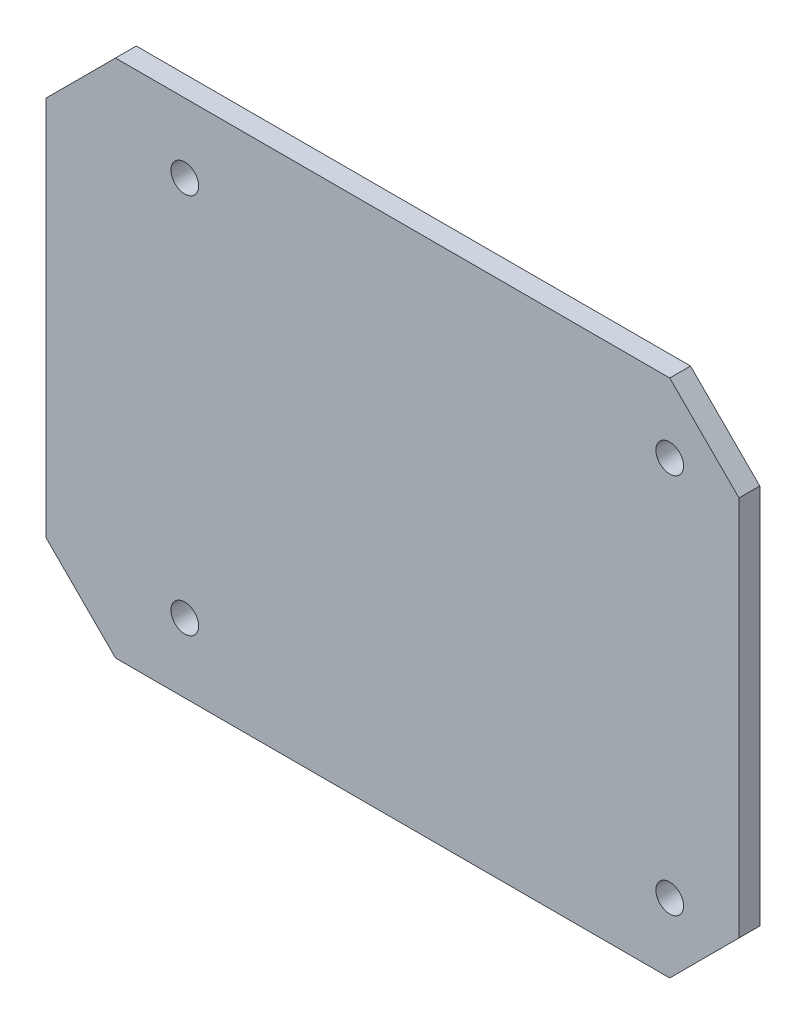
ISO-10303-21;
HEADER;
FILE_DESCRIPTION(('STEP AP214'),'2;1');
FILE_NAME('part.step','',(''),(''),'','','');
FILE_SCHEMA(('AUTOMOTIVE_DESIGN { 1 0 10303 214 1 1 1 1 }'));
ENDSEC;
DATA;
#1=APPLICATION_CONTEXT('core data for automotive mechanical design processes');
#2=APPLICATION_PROTOCOL_DEFINITION('international standard','automotive_design',2000,#1);
#3=PRODUCT_CONTEXT('',#1,'mechanical');
#4=PRODUCT('Part','Part','',(#3));
#5=PRODUCT_RELATED_PRODUCT_CATEGORY('part','',(#4));
#6=PRODUCT_DEFINITION_FORMATION('','',#4);
#7=PRODUCT_DEFINITION_CONTEXT('part definition',#1,'design');
#8=PRODUCT_DEFINITION('design','',#6,#7);
#9=PRODUCT_DEFINITION_SHAPE('','',#8);
#10=(LENGTH_UNIT() NAMED_UNIT(*) SI_UNIT(.MILLI.,.METRE.));
#11=(NAMED_UNIT(*) PLANE_ANGLE_UNIT() SI_UNIT($,.RADIAN.));
#12=(NAMED_UNIT(*) SI_UNIT($,.STERADIAN.) SOLID_ANGLE_UNIT());
#13=UNCERTAINTY_MEASURE_WITH_UNIT(LENGTH_MEASURE(1.E-05),#10,'distance_accuracy_value','');
#14=(GEOMETRIC_REPRESENTATION_CONTEXT(3) GLOBAL_UNCERTAINTY_ASSIGNED_CONTEXT((#13)) GLOBAL_UNIT_ASSIGNED_CONTEXT((#10,
#11,#12)) REPRESENTATION_CONTEXT('',''));
#15=CARTESIAN_POINT('',(0.,0.,0.));
#16=DIRECTION('',(0.,0.,1.));
#17=DIRECTION('',(1.,0.,0.));
#18=AXIS2_PLACEMENT_3D('',#15,#16,#17);
#19=CARTESIAN_POINT('',(-99.9999999999999,-541.588058284611,-6.));
#20=DIRECTION('',(-1.,0.,0.));
#21=DIRECTION('',(0.,-1.,0.));
#22=AXIS2_PLACEMENT_3D('',#19,#20,#21);
#23=PLANE('',#22);
#24=DIRECTION('',(0.,-1.,0.));
#25=VECTOR('',#24,1.);
#26=CARTESIAN_POINT('',(-99.9999999999999,-541.588058284611,-6.));
#27=LINE('',#26,#25);
#28=CARTESIAN_POINT('',(-100.,-561.588058284611,-6.));
#29=VERTEX_POINT('',#28);
#30=CARTESIAN_POINT('',(-99.9999999999999,-671.588058284611,-6.));
#31=VERTEX_POINT('',#30);
#32=EDGE_CURVE('E138',#29,#31,#27,.T.);
#33=ORIENTED_EDGE('',*,*,#32,.T.);
#34=DIRECTION('',(0.,0.,1.));
#35=VECTOR('',#34,1.);
#36=CARTESIAN_POINT('',(-99.9999999999999,-671.588058284611,-6.));
#37=LINE('',#36,#35);
#38=CARTESIAN_POINT('',(-99.9999999999999,-671.588058284611,0.));
#39=VERTEX_POINT('',#38);
#40=EDGE_CURVE('E180',#31,#39,#37,.T.);
#41=ORIENTED_EDGE('',*,*,#40,.T.);
#42=DIRECTION('',(0.,-1.,0.));
#43=VECTOR('',#42,1.);
#44=CARTESIAN_POINT('',(-99.9999999999999,-541.588058284611,0.));
#45=LINE('',#44,#43);
#46=CARTESIAN_POINT('',(-99.9999999999999,-561.588058284611,0.));
#47=VERTEX_POINT('',#46);
#48=EDGE_CURVE('E186',#47,#39,#45,.T.);
#49=ORIENTED_EDGE('',*,*,#48,.F.);
#50=DIRECTION('',(0.,0.,-1.));
#51=VECTOR('',#50,1.);
#52=CARTESIAN_POINT('',(-99.9999999999999,-561.588058284611,-6.));
#53=LINE('',#52,#51);
#54=EDGE_CURVE('E147',#47,#29,#53,.T.);
#55=ORIENTED_EDGE('',*,*,#54,.T.);
#56=EDGE_LOOP('',(#33,#41,#49,#55));
#57=FACE_BOUND('',#56,.T.);
#58=ADVANCED_FACE('F67',(#57),#23,.T.);
#59=CARTESIAN_POINT('',(100.,-541.588058284611,-6.));
#60=DIRECTION('',(0.,1.,0.));
#61=DIRECTION('',(0.,0.,1.));
#62=AXIS2_PLACEMENT_3D('',#59,#60,#61);
#63=PLANE('',#62);
#64=DIRECTION('',(-1.,0.,0.));
#65=VECTOR('',#64,1.);
#66=CARTESIAN_POINT('',(100.,-541.588058284611,0.));
#67=LINE('',#66,#65);
#68=CARTESIAN_POINT('',(80.0000000000001,-541.588058284611,0.));
#69=VERTEX_POINT('',#68);
#70=CARTESIAN_POINT('',(-79.9999999999999,-541.588058284611,0.));
#71=VERTEX_POINT('',#70);
#72=EDGE_CURVE('E128',#69,#71,#67,.T.);
#73=ORIENTED_EDGE('',*,*,#72,.F.);
#74=DIRECTION('',(0.,0.,-1.));
#75=VECTOR('',#74,1.);
#76=CARTESIAN_POINT('',(80.0000000000001,-541.588058284611,-6.));
#77=LINE('',#76,#75);
#78=CARTESIAN_POINT('',(79.9999999999999,-541.588058284611,-6.));
#79=VERTEX_POINT('',#78);
#80=EDGE_CURVE('E165',#69,#79,#77,.T.);
#81=ORIENTED_EDGE('',*,*,#80,.T.);
#82=DIRECTION('',(-1.,0.,0.));
#83=VECTOR('',#82,1.);
#84=CARTESIAN_POINT('',(100.,-541.588058284611,-6.));
#85=LINE('',#84,#83);
#86=CARTESIAN_POINT('',(-80.,-541.588058284611,-6.));
#87=VERTEX_POINT('',#86);
#88=EDGE_CURVE('E151',#79,#87,#85,.T.);
#89=ORIENTED_EDGE('',*,*,#88,.T.);
#90=DIRECTION('',(0.,0.,1.));
#91=VECTOR('',#90,1.);
#92=CARTESIAN_POINT('',(-79.9999999999999,-541.588058284611,-6.));
#93=LINE('',#92,#91);
#94=EDGE_CURVE('E146',#87,#71,#93,.T.);
#95=ORIENTED_EDGE('',*,*,#94,.T.);
#96=EDGE_LOOP('',(#73,#81,#89,#95));
#97=FACE_BOUND('',#96,.T.);
#98=ADVANCED_FACE('F149',(#97),#63,.T.);
#99=CARTESIAN_POINT('',(100.,-541.588058284611,-6.));
#100=DIRECTION('',(1.,0.,0.));
#101=DIRECTION('',(0.,1.,0.));
#102=AXIS2_PLACEMENT_3D('',#99,#100,#101);
#103=PLANE('',#102);
#104=DIRECTION('',(0.,1.,0.));
#105=VECTOR('',#104,1.);
#106=CARTESIAN_POINT('',(100.,-541.588058284611,0.));
#107=LINE('',#106,#105);
#108=CARTESIAN_POINT('',(100.,-671.588058284611,0.));
#109=VERTEX_POINT('',#108);
#110=CARTESIAN_POINT('',(100.,-561.588058284611,0.));
#111=VERTEX_POINT('',#110);
#112=EDGE_CURVE('E139',#109,#111,#107,.T.);
#113=ORIENTED_EDGE('',*,*,#112,.F.);
#114=DIRECTION('',(0.,0.,-1.));
#115=VECTOR('',#114,1.);
#116=CARTESIAN_POINT('',(100.,-671.588058284611,-6.));
#117=LINE('',#116,#115);
#118=CARTESIAN_POINT('',(100.,-671.588058284611,-6.));
#119=VERTEX_POINT('',#118);
#120=EDGE_CURVE('E175',#109,#119,#117,.T.);
#121=ORIENTED_EDGE('',*,*,#120,.T.);
#122=DIRECTION('',(0.,1.,0.));
#123=VECTOR('',#122,1.);
#124=CARTESIAN_POINT('',(100.,-541.588058284611,-6.));
#125=LINE('',#124,#123);
#126=CARTESIAN_POINT('',(100.,-561.588058284611,-6.));
#127=VERTEX_POINT('',#126);
#128=EDGE_CURVE('E154',#119,#127,#125,.T.);
#129=ORIENTED_EDGE('',*,*,#128,.T.);
#130=DIRECTION('',(0.,0.,1.));
#131=VECTOR('',#130,1.);
#132=CARTESIAN_POINT('',(100.,-561.588058284611,-6.));
#133=LINE('',#132,#131);
#134=EDGE_CURVE('E161',#127,#111,#133,.T.);
#135=ORIENTED_EDGE('',*,*,#134,.T.);
#136=EDGE_LOOP('',(#113,#121,#129,#135));
#137=FACE_BOUND('',#136,.T.);
#138=ADVANCED_FACE('F206',(#137),#103,.T.);
#139=CARTESIAN_POINT('',(100.,-691.588058284611,-6.));
#140=DIRECTION('',(0.,-1.,0.));
#141=DIRECTION('',(0.,0.,-1.));
#142=AXIS2_PLACEMENT_3D('',#139,#140,#141);
#143=PLANE('',#142);
#144=DIRECTION('',(1.,0.,0.));
#145=VECTOR('',#144,1.);
#146=CARTESIAN_POINT('',(100.,-691.588058284611,0.));
#147=LINE('',#146,#145);
#148=CARTESIAN_POINT('',(-79.9999999999999,-691.588058284611,0.));
#149=VERTEX_POINT('',#148);
#150=CARTESIAN_POINT('',(80.0000000000001,-691.588058284611,0.));
#151=VERTEX_POINT('',#150);
#152=EDGE_CURVE('E190',#149,#151,#147,.T.);
#153=ORIENTED_EDGE('',*,*,#152,.F.);
#154=DIRECTION('',(0.,0.,-1.));
#155=VECTOR('',#154,1.);
#156=CARTESIAN_POINT('',(-79.9999999999999,-691.588058284611,-6.));
#157=LINE('',#156,#155);
#158=CARTESIAN_POINT('',(-80.,-691.588058284611,-6.));
#159=VERTEX_POINT('',#158);
#160=EDGE_CURVE('E75',#149,#159,#157,.T.);
#161=ORIENTED_EDGE('',*,*,#160,.T.);
#162=DIRECTION('',(1.,0.,0.));
#163=VECTOR('',#162,1.);
#164=CARTESIAN_POINT('',(100.,-691.588058284611,-6.));
#165=LINE('',#164,#163);
#166=CARTESIAN_POINT('',(80.0000000000001,-691.588058284611,-6.));
#167=VERTEX_POINT('',#166);
#168=EDGE_CURVE('E210',#159,#167,#165,.T.);
#169=ORIENTED_EDGE('',*,*,#168,.T.);
#170=DIRECTION('',(0.,0.,1.));
#171=VECTOR('',#170,1.);
#172=CARTESIAN_POINT('',(80.0000000000001,-691.588058284611,-6.));
#173=LINE('',#172,#171);
#174=EDGE_CURVE('E170',#167,#151,#173,.T.);
#175=ORIENTED_EDGE('',*,*,#174,.T.);
#176=EDGE_LOOP('',(#153,#161,#169,#175));
#177=FACE_BOUND('',#176,.T.);
#178=ADVANCED_FACE('F240',(#177),#143,.T.);
#179=CARTESIAN_POINT('',(0.,0.,-6.));
#180=DIRECTION('',(0.,0.,-1.));
#181=DIRECTION('',(-1.,0.,0.));
#182=AXIS2_PLACEMENT_3D('',#179,#180,#181);
#183=PLANE('',#182);
#184=CARTESIAN_POINT('',(80.0000000000001,-561.588058284611,-6.));
#185=DIRECTION('',(0.,0.,-1.));
#186=DIRECTION('',(-1.,0.,0.));
#187=AXIS2_PLACEMENT_3D('',#184,#185,#186);
#188=CIRCLE('',#187,4.);
#189=CARTESIAN_POINT('',(76.0000000000001,-561.588058284611,-6.));
#190=VERTEX_POINT('',#189);
#191=EDGE_CURVE('E232',#190,#190,#188,.T.);
#192=ORIENTED_EDGE('',*,*,#191,.F.);
#193=EDGE_LOOP('',(#192));
#194=FACE_BOUND('',#193,.T.);
#195=CARTESIAN_POINT('',(80.0000000000001,-671.588058284611,-6.));
#196=DIRECTION('',(0.,0.,-1.));
#197=DIRECTION('',(-1.,0.,0.));
#198=AXIS2_PLACEMENT_3D('',#195,#196,#197);
#199=CIRCLE('',#198,4.);
#200=CARTESIAN_POINT('',(76.0000000000001,-671.588058284611,-6.));
#201=VERTEX_POINT('',#200);
#202=EDGE_CURVE('E226',#201,#201,#199,.T.);
#203=ORIENTED_EDGE('',*,*,#202,.F.);
#204=EDGE_LOOP('',(#203));
#205=FACE_BOUND('',#204,.T.);
#206=CARTESIAN_POINT('',(-60.,-561.588058284611,-6.));
#207=DIRECTION('',(0.,0.,-1.));
#208=DIRECTION('',(-1.,0.,0.));
#209=AXIS2_PLACEMENT_3D('',#206,#207,#208);
#210=CIRCLE('',#209,4.);
#211=CARTESIAN_POINT('',(-64.,-561.588058284611,-6.));
#212=VERTEX_POINT('',#211);
#213=EDGE_CURVE('E220',#212,#212,#210,.T.);
#214=ORIENTED_EDGE('',*,*,#213,.F.);
#215=EDGE_LOOP('',(#214));
#216=FACE_BOUND('',#215,.T.);
#217=CARTESIAN_POINT('',(-60.,-671.588058284611,-6.));
#218=DIRECTION('',(0.,0.,-1.));
#219=DIRECTION('',(-1.,0.,0.));
#220=AXIS2_PLACEMENT_3D('',#217,#218,#219);
#221=CIRCLE('',#220,4.);
#222=CARTESIAN_POINT('',(-64.,-671.588058284611,-6.));
#223=VERTEX_POINT('',#222);
#224=EDGE_CURVE('E195',#223,#223,#221,.T.);
#225=ORIENTED_EDGE('',*,*,#224,.F.);
#226=EDGE_LOOP('',(#225));
#227=FACE_BOUND('',#226,.T.);
#228=ORIENTED_EDGE('',*,*,#168,.F.);
#229=DIRECTION('',(0.707106781186547,-0.707106781186548,0.));
#230=VECTOR('',#229,1.);
#231=CARTESIAN_POINT('',(-385.794029142306,-385.794029142305,-6.));
#232=LINE('',#231,#230);
#233=EDGE_CURVE('E13',#159,#31,#232,.F.);
#234=ORIENTED_EDGE('',*,*,#233,.T.);
#235=ORIENTED_EDGE('',*,*,#32,.F.);
#236=DIRECTION('',(-0.707106781186548,-0.707106781186548,0.));
#237=VECTOR('',#236,1.);
#238=CARTESIAN_POINT('',(230.794029142306,-230.794029142306,-6.));
#239=LINE('',#238,#237);
#240=EDGE_CURVE('E159',#29,#87,#239,.F.);
#241=ORIENTED_EDGE('',*,*,#240,.T.);
#242=ORIENTED_EDGE('',*,*,#88,.F.);
#243=DIRECTION('',(-0.707106781186547,0.707106781186548,0.));
#244=VECTOR('',#243,1.);
#245=CARTESIAN_POINT('',(-230.794029142305,-230.794029142305,-6.));
#246=LINE('',#245,#244);
#247=EDGE_CURVE('E167',#79,#127,#246,.F.);
#248=ORIENTED_EDGE('',*,*,#247,.T.);
#249=ORIENTED_EDGE('',*,*,#128,.F.);
#250=DIRECTION('',(0.707106781186547,0.707106781186548,0.));
#251=VECTOR('',#250,1.);
#252=CARTESIAN_POINT('',(385.794029142306,-385.794029142305,-6.));
#253=LINE('',#252,#251);
#254=EDGE_CURVE('E177',#119,#167,#253,.F.);
#255=ORIENTED_EDGE('',*,*,#254,.T.);
#256=EDGE_LOOP('',(#228,#234,#235,#241,#242,#248,#249,#255));
#257=FACE_BOUND('',#256,.T.);
#258=ADVANCED_FACE('F211',(#194,#205,#216,#227,#257),#183,.T.);
#259=CARTESIAN_POINT('',(0.,0.,0.));
#260=DIRECTION('',(0.,0.,-1.));
#261=DIRECTION('',(-1.,0.,0.));
#262=AXIS2_PLACEMENT_3D('',#259,#260,#261);
#263=PLANE('',#262);
#264=CARTESIAN_POINT('',(80.0000000000001,-561.588058284611,0.));
#265=DIRECTION('',(0.,0.,-1.));
#266=DIRECTION('',(-1.,0.,0.));
#267=AXIS2_PLACEMENT_3D('',#264,#265,#266);
#268=CIRCLE('',#267,4.);
#269=CARTESIAN_POINT('',(76.0000000000001,-561.588058284611,0.));
#270=VERTEX_POINT('',#269);
#271=EDGE_CURVE('E229',#270,#270,#268,.T.);
#272=ORIENTED_EDGE('',*,*,#271,.T.);
#273=EDGE_LOOP('',(#272));
#274=FACE_BOUND('',#273,.T.);
#275=CARTESIAN_POINT('',(80.0000000000001,-671.588058284611,0.));
#276=DIRECTION('',(0.,0.,-1.));
#277=DIRECTION('',(-1.,0.,0.));
#278=AXIS2_PLACEMENT_3D('',#275,#276,#277);
#279=CIRCLE('',#278,4.);
#280=CARTESIAN_POINT('',(76.0000000000001,-671.588058284611,0.));
#281=VERTEX_POINT('',#280);
#282=EDGE_CURVE('E223',#281,#281,#279,.T.);
#283=ORIENTED_EDGE('',*,*,#282,.T.);
#284=EDGE_LOOP('',(#283));
#285=FACE_BOUND('',#284,.T.);
#286=CARTESIAN_POINT('',(-60.,-561.588058284611,0.));
#287=DIRECTION('',(0.,0.,-1.));
#288=DIRECTION('',(-1.,0.,0.));
#289=AXIS2_PLACEMENT_3D('',#286,#287,#288);
#290=CIRCLE('',#289,4.);
#291=CARTESIAN_POINT('',(-64.,-561.588058284611,0.));
#292=VERTEX_POINT('',#291);
#293=EDGE_CURVE('E217',#292,#292,#290,.T.);
#294=ORIENTED_EDGE('',*,*,#293,.T.);
#295=EDGE_LOOP('',(#294));
#296=FACE_BOUND('',#295,.T.);
#297=CARTESIAN_POINT('',(-60.,-671.588058284611,0.));
#298=DIRECTION('',(0.,0.,-1.));
#299=DIRECTION('',(-1.,0.,0.));
#300=AXIS2_PLACEMENT_3D('',#297,#298,#299);
#301=CIRCLE('',#300,4.);
#302=CARTESIAN_POINT('',(-64.,-671.588058284611,0.));
#303=VERTEX_POINT('',#302);
#304=EDGE_CURVE('E191',#303,#303,#301,.T.);
#305=ORIENTED_EDGE('',*,*,#304,.T.);
#306=EDGE_LOOP('',(#305));
#307=FACE_BOUND('',#306,.T.);
#308=ORIENTED_EDGE('',*,*,#48,.T.);
#309=DIRECTION('',(-0.707106781186547,0.707106781186548,0.));
#310=VECTOR('',#309,1.);
#311=CARTESIAN_POINT('',(-99.9999999999999,-671.588058284611,0.));
#312=LINE('',#311,#310);
#313=EDGE_CURVE('E89',#39,#149,#312,.F.);
#314=ORIENTED_EDGE('',*,*,#313,.T.);
#315=ORIENTED_EDGE('',*,*,#152,.T.);
#316=DIRECTION('',(-0.707106781186547,-0.707106781186548,0.));
#317=VECTOR('',#316,1.);
#318=CARTESIAN_POINT('',(80.0000000000001,-691.588058284611,0.));
#319=LINE('',#318,#317);
#320=EDGE_CURVE('E173',#151,#109,#319,.F.);
#321=ORIENTED_EDGE('',*,*,#320,.T.);
#322=ORIENTED_EDGE('',*,*,#112,.T.);
#323=DIRECTION('',(0.707106781186547,-0.707106781186548,0.));
#324=VECTOR('',#323,1.);
#325=CARTESIAN_POINT('',(100.,-561.588058284611,0.));
#326=LINE('',#325,#324);
#327=EDGE_CURVE('E134',#111,#69,#326,.F.);
#328=ORIENTED_EDGE('',*,*,#327,.T.);
#329=ORIENTED_EDGE('',*,*,#72,.T.);
#330=DIRECTION('',(0.707106781186548,0.707106781186548,0.));
#331=VECTOR('',#330,1.);
#332=CARTESIAN_POINT('',(-79.9999999999999,-541.588058284611,0.));
#333=LINE('',#332,#331);
#334=EDGE_CURVE('E131',#71,#47,#333,.F.);
#335=ORIENTED_EDGE('',*,*,#334,.T.);
#336=EDGE_LOOP('',(#308,#314,#315,#321,#322,#328,#329,#335));
#337=FACE_BOUND('',#336,.T.);
#338=ADVANCED_FACE('F130',(#274,#285,#296,#307,#337),#263,.F.);
#339=CARTESIAN_POINT('',(-79.9999999999999,-541.588058284611,-6.));
#340=DIRECTION('',(0.707106781186547,-0.707106781186547,0.));
#341=DIRECTION('',(0.,0.,1.));
#342=AXIS2_PLACEMENT_3D('',#339,#340,#341);
#343=PLANE('',#342);
#344=ORIENTED_EDGE('',*,*,#240,.F.);
#345=ORIENTED_EDGE('',*,*,#54,.F.);
#346=ORIENTED_EDGE('',*,*,#334,.F.);
#347=ORIENTED_EDGE('',*,*,#94,.F.);
#348=EDGE_LOOP('',(#344,#345,#346,#347));
#349=FACE_BOUND('',#348,.T.);
#350=ADVANCED_FACE('F145',(#349),#343,.F.);
#351=CARTESIAN_POINT('',(100.,-561.588058284611,-6.));
#352=DIRECTION('',(-0.707106781186548,-0.707106781186547,0.));
#353=DIRECTION('',(0.,0.,1.));
#354=AXIS2_PLACEMENT_3D('',#351,#352,#353);
#355=PLANE('',#354);
#356=ORIENTED_EDGE('',*,*,#247,.F.);
#357=ORIENTED_EDGE('',*,*,#80,.F.);
#358=ORIENTED_EDGE('',*,*,#327,.F.);
#359=ORIENTED_EDGE('',*,*,#134,.F.);
#360=EDGE_LOOP('',(#356,#357,#358,#359));
#361=FACE_BOUND('',#360,.T.);
#362=ADVANCED_FACE('F205',(#361),#355,.F.);
#363=CARTESIAN_POINT('',(80.0000000000001,-691.588058284611,-6.));
#364=DIRECTION('',(-0.707106781186548,0.707106781186547,0.));
#365=DIRECTION('',(0.,0.,1.));
#366=AXIS2_PLACEMENT_3D('',#363,#364,#365);
#367=PLANE('',#366);
#368=ORIENTED_EDGE('',*,*,#254,.F.);
#369=ORIENTED_EDGE('',*,*,#120,.F.);
#370=ORIENTED_EDGE('',*,*,#320,.F.);
#371=ORIENTED_EDGE('',*,*,#174,.F.);
#372=EDGE_LOOP('',(#368,#369,#370,#371));
#373=FACE_BOUND('',#372,.T.);
#374=ADVANCED_FACE('F260',(#373),#367,.F.);
#375=CARTESIAN_POINT('',(-99.9999999999999,-671.588058284611,-6.));
#376=DIRECTION('',(0.707106781186548,0.707106781186547,0.));
#377=DIRECTION('',(0.,0.,1.));
#378=AXIS2_PLACEMENT_3D('',#375,#376,#377);
#379=PLANE('',#378);
#380=ORIENTED_EDGE('',*,*,#233,.F.);
#381=ORIENTED_EDGE('',*,*,#160,.F.);
#382=ORIENTED_EDGE('',*,*,#313,.F.);
#383=ORIENTED_EDGE('',*,*,#40,.F.);
#384=EDGE_LOOP('',(#380,#381,#382,#383));
#385=FACE_BOUND('',#384,.T.);
#386=ADVANCED_FACE('F69',(#385),#379,.F.);
#387=CARTESIAN_POINT('',(-60.,-671.588058284611,-6.));
#388=DIRECTION('',(0.,0.,-1.));
#389=DIRECTION('',(-1.,0.,0.));
#390=AXIS2_PLACEMENT_3D('',#387,#388,#389);
#391=CYLINDRICAL_SURFACE('',#390,4.);
#392=ORIENTED_EDGE('',*,*,#304,.F.);
#393=EDGE_LOOP('',(#392));
#394=FACE_BOUND('',#393,.T.);
#395=ORIENTED_EDGE('',*,*,#224,.T.);
#396=EDGE_LOOP('',(#395));
#397=FACE_BOUND('',#396,.T.);
#398=ADVANCED_FACE('F248',(#394,#397),#391,.F.);
#399=CARTESIAN_POINT('',(-60.,-561.588058284611,-6.));
#400=DIRECTION('',(0.,0.,-1.));
#401=DIRECTION('',(-1.,0.,0.));
#402=AXIS2_PLACEMENT_3D('',#399,#400,#401);
#403=CYLINDRICAL_SURFACE('',#402,4.);
#404=ORIENTED_EDGE('',*,*,#293,.F.);
#405=EDGE_LOOP('',(#404));
#406=FACE_BOUND('',#405,.T.);
#407=ORIENTED_EDGE('',*,*,#213,.T.);
#408=EDGE_LOOP('',(#407));
#409=FACE_BOUND('',#408,.T.);
#410=ADVANCED_FACE('F250',(#406,#409),#403,.F.);
#411=CARTESIAN_POINT('',(80.0000000000001,-671.588058284611,-6.));
#412=DIRECTION('',(0.,0.,-1.));
#413=DIRECTION('',(-1.,0.,0.));
#414=AXIS2_PLACEMENT_3D('',#411,#412,#413);
#415=CYLINDRICAL_SURFACE('',#414,4.);
#416=ORIENTED_EDGE('',*,*,#282,.F.);
#417=EDGE_LOOP('',(#416));
#418=FACE_BOUND('',#417,.T.);
#419=ORIENTED_EDGE('',*,*,#202,.T.);
#420=EDGE_LOOP('',(#419));
#421=FACE_BOUND('',#420,.T.);
#422=ADVANCED_FACE('F257',(#418,#421),#415,.F.);
#423=CARTESIAN_POINT('',(80.0000000000001,-561.588058284611,-6.));
#424=DIRECTION('',(0.,0.,-1.));
#425=DIRECTION('',(-1.,0.,0.));
#426=AXIS2_PLACEMENT_3D('',#423,#424,#425);
#427=CYLINDRICAL_SURFACE('',#426,4.);
#428=ORIENTED_EDGE('',*,*,#271,.F.);
#429=EDGE_LOOP('',(#428));
#430=FACE_BOUND('',#429,.T.);
#431=ORIENTED_EDGE('',*,*,#191,.T.);
#432=EDGE_LOOP('',(#431));
#433=FACE_BOUND('',#432,.T.);
#434=ADVANCED_FACE('F236',(#430,#433),#427,.F.);
#435=CLOSED_SHELL('',(#58,#98,#138,#178,#258,#338,#350,#362,#374,#386,#398,#410,#422,#434));
#436=MANIFOLD_SOLID_BREP('B2',#435);
#437=ADVANCED_BREP_SHAPE_REPRESENTATION('',(#18,#436),#14);
#438=SHAPE_DEFINITION_REPRESENTATION(#9,#437);
ENDSEC;
END-ISO-10303-21;
